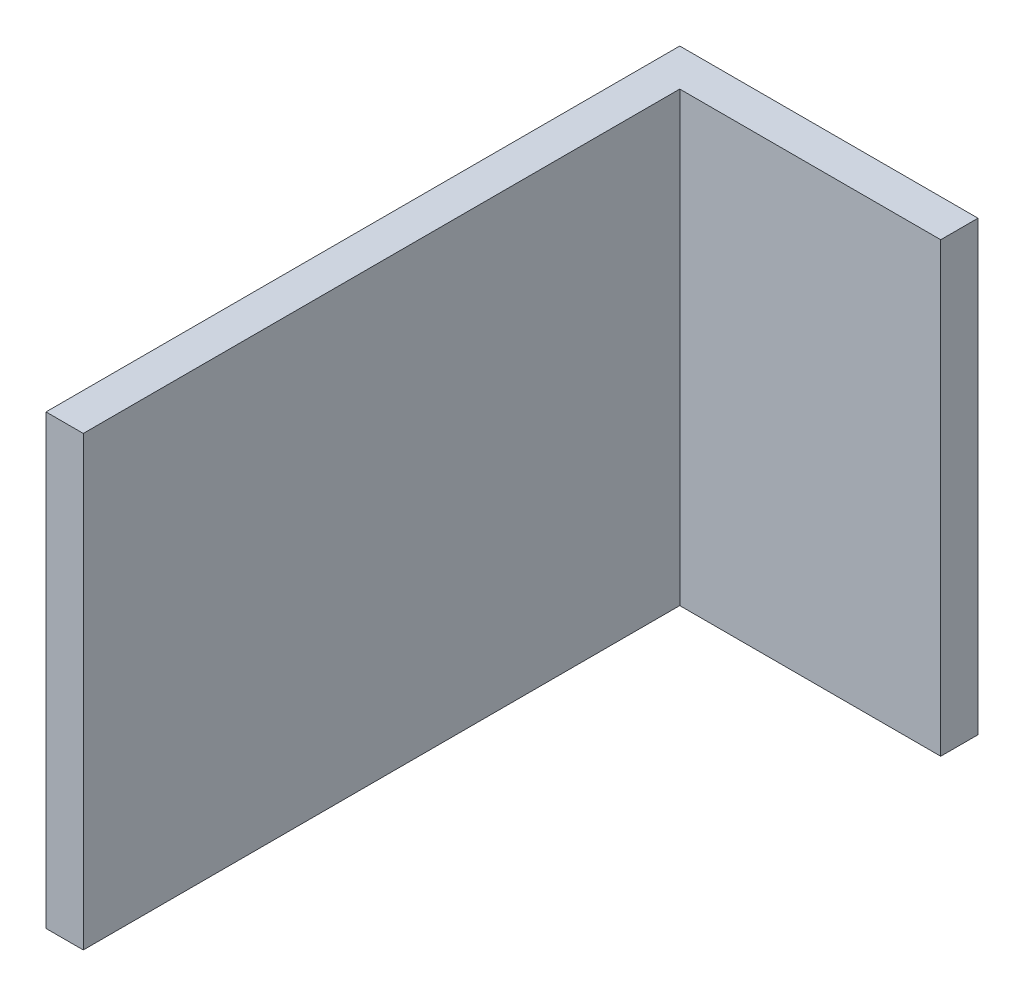
ISO-10303-21;
HEADER;
FILE_DESCRIPTION(('STEP AP214'),'2;1');
FILE_NAME('part.step','',(''),(''),'','','');
FILE_SCHEMA(('AUTOMOTIVE_DESIGN { 1 0 10303 214 1 1 1 1 }'));
ENDSEC;
DATA;
#1=APPLICATION_CONTEXT('core data for automotive mechanical design processes');
#2=APPLICATION_PROTOCOL_DEFINITION('international standard','automotive_design',2000,#1);
#3=PRODUCT_CONTEXT('',#1,'mechanical');
#4=PRODUCT('Part','Part','',(#3));
#5=PRODUCT_RELATED_PRODUCT_CATEGORY('part','',(#4));
#6=PRODUCT_DEFINITION_FORMATION('','',#4);
#7=PRODUCT_DEFINITION_CONTEXT('part definition',#1,'design');
#8=PRODUCT_DEFINITION('design','',#6,#7);
#9=PRODUCT_DEFINITION_SHAPE('','',#8);
#10=(LENGTH_UNIT() NAMED_UNIT(*) SI_UNIT(.MILLI.,.METRE.));
#11=(NAMED_UNIT(*) PLANE_ANGLE_UNIT() SI_UNIT($,.RADIAN.));
#12=(NAMED_UNIT(*) SI_UNIT($,.STERADIAN.) SOLID_ANGLE_UNIT());
#13=UNCERTAINTY_MEASURE_WITH_UNIT(LENGTH_MEASURE(1.E-05),#10,'distance_accuracy_value','');
#14=(GEOMETRIC_REPRESENTATION_CONTEXT(3) GLOBAL_UNCERTAINTY_ASSIGNED_CONTEXT((#13)) GLOBAL_UNIT_ASSIGNED_CONTEXT((#10,
#11,#12)) REPRESENTATION_CONTEXT('',''));
#15=CARTESIAN_POINT('',(0.,0.,0.));
#16=DIRECTION('',(0.,0.,1.));
#17=DIRECTION('',(1.,0.,0.));
#18=AXIS2_PLACEMENT_3D('',#15,#16,#17);
#19=CARTESIAN_POINT('',(0.,0.,3.175));
#20=DIRECTION('',(0.,0.,-1.));
#21=DIRECTION('',(-1.,0.,0.));
#22=AXIS2_PLACEMENT_3D('',#19,#20,#21);
#23=PLANE('',#22);
#24=DIRECTION('',(0.,1.,0.));
#25=VECTOR('',#24,1.);
#26=CARTESIAN_POINT('',(3.17499999999999,38.1,3.175));
#27=LINE('',#26,#25);
#28=CARTESIAN_POINT('',(3.17499999999999,0.,3.175));
#29=VERTEX_POINT('',#28);
#30=CARTESIAN_POINT('',(3.17499999999999,38.1,3.175));
#31=VERTEX_POINT('',#30);
#32=EDGE_CURVE('E55',#29,#31,#27,.T.);
#33=ORIENTED_EDGE('',*,*,#32,.F.);
#34=DIRECTION('',(1.,0.,0.));
#35=VECTOR('',#34,1.);
#36=CARTESIAN_POINT('',(0.,0.,3.175));
#37=LINE('',#36,#35);
#38=CARTESIAN_POINT('',(25.4,0.,3.175));
#39=VERTEX_POINT('',#38);
#40=EDGE_CURVE('E93',#29,#39,#37,.T.);
#41=ORIENTED_EDGE('',*,*,#40,.T.);
#42=DIRECTION('',(0.,1.,0.));
#43=VECTOR('',#42,1.);
#44=CARTESIAN_POINT('',(25.4,0.,3.175));
#45=LINE('',#44,#43);
#46=CARTESIAN_POINT('',(25.4,38.1,3.175));
#47=VERTEX_POINT('',#46);
#48=EDGE_CURVE('E61',#39,#47,#45,.T.);
#49=ORIENTED_EDGE('',*,*,#48,.T.);
#50=DIRECTION('',(-1.,0.,0.));
#51=VECTOR('',#50,1.);
#52=CARTESIAN_POINT('',(0.,38.1,3.175));
#53=LINE('',#52,#51);
#54=EDGE_CURVE('E104',#47,#31,#53,.T.);
#55=ORIENTED_EDGE('',*,*,#54,.T.);
#56=EDGE_LOOP('',(#33,#41,#49,#55));
#57=FACE_BOUND('',#56,.T.);
#58=ADVANCED_FACE('F39',(#57),#23,.F.);
#59=CARTESIAN_POINT('',(0.,0.,3.175));
#60=DIRECTION('',(1.,0.,0.));
#61=DIRECTION('',(0.,1.,0.));
#62=AXIS2_PLACEMENT_3D('',#59,#60,#61);
#63=PLANE('',#62);
#64=DIRECTION('',(0.,-1.,0.));
#65=VECTOR('',#64,1.);
#66=CARTESIAN_POINT('',(0.,0.,0.));
#67=LINE('',#66,#65);
#68=CARTESIAN_POINT('',(0.,38.1,0.));
#69=VERTEX_POINT('',#68);
#70=CARTESIAN_POINT('',(0.,0.,0.));
#71=VERTEX_POINT('',#70);
#72=EDGE_CURVE('E100',#69,#71,#67,.T.);
#73=ORIENTED_EDGE('',*,*,#72,.T.);
#74=DIRECTION('',(0.,0.,-1.));
#75=VECTOR('',#74,1.);
#76=CARTESIAN_POINT('',(0.,0.,3.175));
#77=LINE('',#76,#75);
#78=CARTESIAN_POINT('',(0.,0.,53.975));
#79=VERTEX_POINT('',#78);
#80=EDGE_CURVE('E11',#79,#71,#77,.T.);
#81=ORIENTED_EDGE('',*,*,#80,.F.);
#82=DIRECTION('',(0.,-1.,0.));
#83=VECTOR('',#82,1.);
#84=CARTESIAN_POINT('',(0.,38.1,53.975));
#85=LINE('',#84,#83);
#86=CARTESIAN_POINT('',(0.,38.1,53.975));
#87=VERTEX_POINT('',#86);
#88=EDGE_CURVE('E102',#87,#79,#85,.T.);
#89=ORIENTED_EDGE('',*,*,#88,.F.);
#90=DIRECTION('',(0.,0.,-1.));
#91=VECTOR('',#90,1.);
#92=CARTESIAN_POINT('',(0.,38.1,3.175));
#93=LINE('',#92,#91);
#94=EDGE_CURVE('E85',#87,#69,#93,.T.);
#95=ORIENTED_EDGE('',*,*,#94,.T.);
#96=EDGE_LOOP('',(#73,#81,#89,#95));
#97=FACE_BOUND('',#96,.T.);
#98=ADVANCED_FACE('F41',(#97),#63,.F.);
#99=CARTESIAN_POINT('',(0.,0.,3.175));
#100=DIRECTION('',(0.,1.,0.));
#101=DIRECTION('',(0.,0.,1.));
#102=AXIS2_PLACEMENT_3D('',#99,#100,#101);
#103=PLANE('',#102);
#104=DIRECTION('',(1.,0.,0.));
#105=VECTOR('',#104,1.);
#106=CARTESIAN_POINT('',(0.,0.,0.));
#107=LINE('',#106,#105);
#108=CARTESIAN_POINT('',(25.4,0.,0.));
#109=VERTEX_POINT('',#108);
#110=EDGE_CURVE('E107',#71,#109,#107,.T.);
#111=ORIENTED_EDGE('',*,*,#110,.T.);
#112=DIRECTION('',(0.,0.,-1.));
#113=VECTOR('',#112,1.);
#114=CARTESIAN_POINT('',(25.4,0.,3.175));
#115=LINE('',#114,#113);
#116=EDGE_CURVE('E48',#39,#109,#115,.T.);
#117=ORIENTED_EDGE('',*,*,#116,.F.);
#118=ORIENTED_EDGE('',*,*,#40,.F.);
#119=DIRECTION('',(0.,0.,-1.));
#120=VECTOR('',#119,1.);
#121=CARTESIAN_POINT('',(3.17499999999999,0.,53.975));
#122=LINE('',#121,#120);
#123=CARTESIAN_POINT('',(3.17499999999999,0.,53.975));
#124=VERTEX_POINT('',#123);
#125=EDGE_CURVE('E109',#124,#29,#122,.T.);
#126=ORIENTED_EDGE('',*,*,#125,.F.);
#127=DIRECTION('',(1.,0.,0.));
#128=VECTOR('',#127,1.);
#129=CARTESIAN_POINT('',(0.,0.,53.975));
#130=LINE('',#129,#128);
#131=EDGE_CURVE('E134',#79,#124,#130,.T.);
#132=ORIENTED_EDGE('',*,*,#131,.F.);
#133=ORIENTED_EDGE('',*,*,#80,.T.);
#134=EDGE_LOOP('',(#111,#117,#118,#126,#132,#133));
#135=FACE_BOUND('',#134,.T.);
#136=ADVANCED_FACE('F129',(#135),#103,.F.);
#137=CARTESIAN_POINT('',(25.4,0.,3.175));
#138=DIRECTION('',(-1.,0.,0.));
#139=DIRECTION('',(0.,-1.,0.));
#140=AXIS2_PLACEMENT_3D('',#137,#138,#139);
#141=PLANE('',#140);
#142=DIRECTION('',(0.,1.,0.));
#143=VECTOR('',#142,1.);
#144=CARTESIAN_POINT('',(25.4,0.,0.));
#145=LINE('',#144,#143);
#146=CARTESIAN_POINT('',(25.4,38.1,0.));
#147=VERTEX_POINT('',#146);
#148=EDGE_CURVE('E94',#109,#147,#145,.T.);
#149=ORIENTED_EDGE('',*,*,#148,.T.);
#150=DIRECTION('',(0.,0.,-1.));
#151=VECTOR('',#150,1.);
#152=CARTESIAN_POINT('',(25.4,38.1,3.175));
#153=LINE('',#152,#151);
#154=EDGE_CURVE('E88',#47,#147,#153,.T.);
#155=ORIENTED_EDGE('',*,*,#154,.F.);
#156=ORIENTED_EDGE('',*,*,#48,.F.);
#157=ORIENTED_EDGE('',*,*,#116,.T.);
#158=EDGE_LOOP('',(#149,#155,#156,#157));
#159=FACE_BOUND('',#158,.T.);
#160=ADVANCED_FACE('F127',(#159),#141,.F.);
#161=CARTESIAN_POINT('',(0.,38.1,3.175));
#162=DIRECTION('',(0.,-1.,0.));
#163=DIRECTION('',(0.,0.,-1.));
#164=AXIS2_PLACEMENT_3D('',#161,#162,#163);
#165=PLANE('',#164);
#166=DIRECTION('',(-1.,0.,0.));
#167=VECTOR('',#166,1.);
#168=CARTESIAN_POINT('',(0.,38.1,0.));
#169=LINE('',#168,#167);
#170=EDGE_CURVE('E81',#147,#69,#169,.T.);
#171=ORIENTED_EDGE('',*,*,#170,.T.);
#172=ORIENTED_EDGE('',*,*,#94,.F.);
#173=DIRECTION('',(-1.,0.,0.));
#174=VECTOR('',#173,1.);
#175=CARTESIAN_POINT('',(0.,38.1,53.975));
#176=LINE('',#175,#174);
#177=CARTESIAN_POINT('',(3.17499999999999,38.1,53.975));
#178=VERTEX_POINT('',#177);
#179=EDGE_CURVE('E148',#178,#87,#176,.T.);
#180=ORIENTED_EDGE('',*,*,#179,.F.);
#181=DIRECTION('',(0.,0.,-1.));
#182=VECTOR('',#181,1.);
#183=CARTESIAN_POINT('',(3.17499999999999,38.1,53.975));
#184=LINE('',#183,#182);
#185=EDGE_CURVE('E115',#178,#31,#184,.T.);
#186=ORIENTED_EDGE('',*,*,#185,.T.);
#187=ORIENTED_EDGE('',*,*,#54,.F.);
#188=ORIENTED_EDGE('',*,*,#154,.T.);
#189=EDGE_LOOP('',(#171,#172,#180,#186,#187,#188));
#190=FACE_BOUND('',#189,.T.);
#191=ADVANCED_FACE('F83',(#190),#165,.F.);
#192=CARTESIAN_POINT('',(0.,0.,0.));
#193=DIRECTION('',(0.,0.,-1.));
#194=DIRECTION('',(-1.,0.,0.));
#195=AXIS2_PLACEMENT_3D('',#192,#193,#194);
#196=PLANE('',#195);
#197=ORIENTED_EDGE('',*,*,#72,.F.);
#198=ORIENTED_EDGE('',*,*,#170,.F.);
#199=ORIENTED_EDGE('',*,*,#148,.F.);
#200=ORIENTED_EDGE('',*,*,#110,.F.);
#201=EDGE_LOOP('',(#197,#198,#199,#200));
#202=FACE_BOUND('',#201,.T.);
#203=ADVANCED_FACE('F106',(#202),#196,.T.);
#204=CARTESIAN_POINT('',(3.17499999999999,38.1,53.975));
#205=DIRECTION('',(-1.,0.,0.));
#206=DIRECTION('',(0.,-1.,0.));
#207=AXIS2_PLACEMENT_3D('',#204,#205,#206);
#208=PLANE('',#207);
#209=ORIENTED_EDGE('',*,*,#32,.T.);
#210=ORIENTED_EDGE('',*,*,#185,.F.);
#211=DIRECTION('',(0.,1.,0.));
#212=VECTOR('',#211,1.);
#213=CARTESIAN_POINT('',(3.17499999999999,38.1,53.975));
#214=LINE('',#213,#212);
#215=EDGE_CURVE('E145',#124,#178,#214,.T.);
#216=ORIENTED_EDGE('',*,*,#215,.F.);
#217=ORIENTED_EDGE('',*,*,#125,.T.);
#218=EDGE_LOOP('',(#209,#210,#216,#217));
#219=FACE_BOUND('',#218,.T.);
#220=ADVANCED_FACE('F153',(#219),#208,.F.);
#221=CARTESIAN_POINT('',(0.,0.,53.975));
#222=DIRECTION('',(0.,0.,1.));
#223=DIRECTION('',(1.,0.,0.));
#224=AXIS2_PLACEMENT_3D('',#221,#222,#223);
#225=PLANE('',#224);
#226=ORIENTED_EDGE('',*,*,#88,.T.);
#227=ORIENTED_EDGE('',*,*,#131,.T.);
#228=ORIENTED_EDGE('',*,*,#215,.T.);
#229=ORIENTED_EDGE('',*,*,#179,.T.);
#230=EDGE_LOOP('',(#226,#227,#228,#229));
#231=FACE_BOUND('',#230,.T.);
#232=ADVANCED_FACE('F147',(#231),#225,.T.);
#233=CLOSED_SHELL('',(#58,#98,#136,#160,#191,#203,#220,#232));
#234=MANIFOLD_SOLID_BREP('B2',#233);
#235=ADVANCED_BREP_SHAPE_REPRESENTATION('',(#18,#234),#14);
#236=SHAPE_DEFINITION_REPRESENTATION(#9,#235);
ENDSEC;
END-ISO-10303-21;
